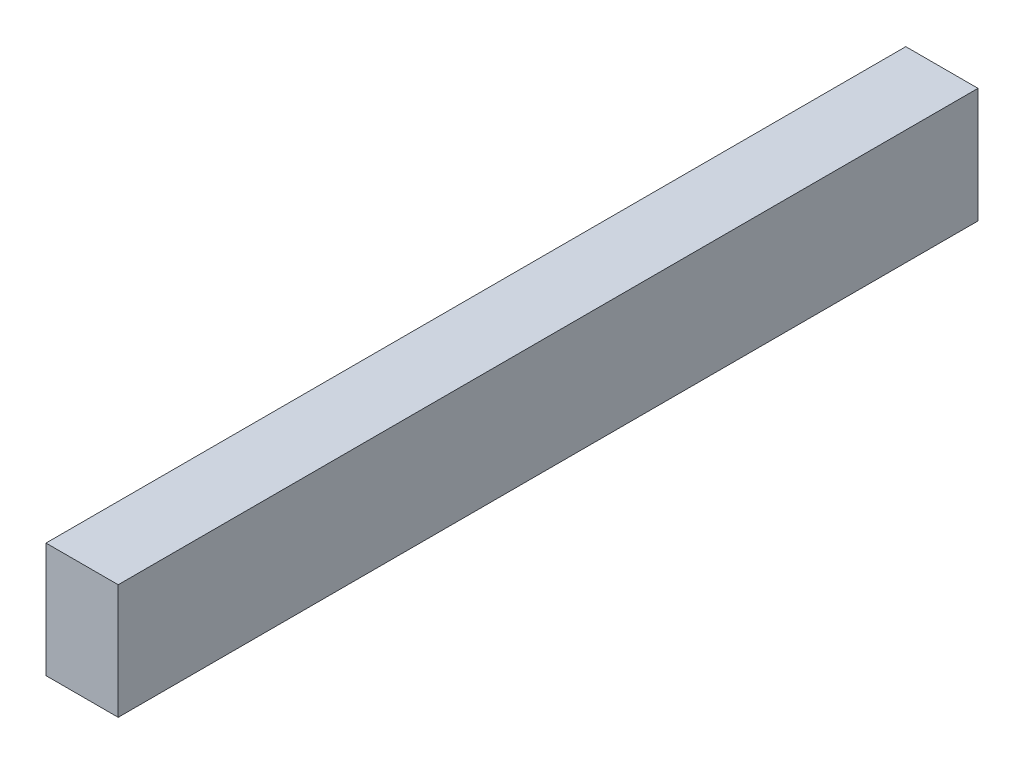
ISO-10303-21;
HEADER;
FILE_DESCRIPTION(('STEP AP214'),'2;1');
FILE_NAME('part.step','',(''),(''),'','','');
FILE_SCHEMA(('AUTOMOTIVE_DESIGN { 1 0 10303 214 1 1 1 1 }'));
ENDSEC;
DATA;
#1=APPLICATION_CONTEXT('core data for automotive mechanical design processes');
#2=APPLICATION_PROTOCOL_DEFINITION('international standard','automotive_design',2000,#1);
#3=PRODUCT_CONTEXT('',#1,'mechanical');
#4=PRODUCT('Part','Part','',(#3));
#5=PRODUCT_RELATED_PRODUCT_CATEGORY('part','',(#4));
#6=PRODUCT_DEFINITION_FORMATION('','',#4);
#7=PRODUCT_DEFINITION_CONTEXT('part definition',#1,'design');
#8=PRODUCT_DEFINITION('design','',#6,#7);
#9=PRODUCT_DEFINITION_SHAPE('','',#8);
#10=(LENGTH_UNIT() NAMED_UNIT(*) SI_UNIT(.MILLI.,.METRE.));
#11=(NAMED_UNIT(*) PLANE_ANGLE_UNIT() SI_UNIT($,.RADIAN.));
#12=(NAMED_UNIT(*) SI_UNIT($,.STERADIAN.) SOLID_ANGLE_UNIT());
#13=UNCERTAINTY_MEASURE_WITH_UNIT(LENGTH_MEASURE(1.E-05),#10,'distance_accuracy_value','');
#14=(GEOMETRIC_REPRESENTATION_CONTEXT(3) GLOBAL_UNCERTAINTY_ASSIGNED_CONTEXT((#13)) GLOBAL_UNIT_ASSIGNED_CONTEXT((#10,
#11,#12)) REPRESENTATION_CONTEXT('',''));
#15=CARTESIAN_POINT('',(0.,0.,0.));
#16=DIRECTION('',(0.,0.,1.));
#17=DIRECTION('',(1.,0.,0.));
#18=AXIS2_PLACEMENT_3D('',#15,#16,#17);
#19=CARTESIAN_POINT('',(-29.5625,10.50625,52.4));
#20=DIRECTION('',(1.,0.,0.));
#21=DIRECTION('',(0.,0.,-1.));
#22=AXIS2_PLACEMENT_3D('',#19,#20,#21);
#23=PLANE('',#22);
#24=DIRECTION('',(0.,-1.,0.));
#25=VECTOR('',#24,1.);
#26=CARTESIAN_POINT('',(-29.5625,10.50625,0.));
#27=LINE('',#26,#25);
#28=CARTESIAN_POINT('',(-29.5625,10.50625,0.));
#29=VERTEX_POINT('',#28);
#30=CARTESIAN_POINT('',(-29.5625,3.50624999999999,0.));
#31=VERTEX_POINT('',#30);
#32=EDGE_CURVE('E102',#29,#31,#27,.T.);
#33=ORIENTED_EDGE('',*,*,#32,.T.);
#34=DIRECTION('',(0.,0.,-1.));
#35=VECTOR('',#34,1.);
#36=CARTESIAN_POINT('',(-29.5625,3.50624999999999,52.4));
#37=LINE('',#36,#35);
#38=CARTESIAN_POINT('',(-29.5625,3.50624999999999,52.4));
#39=VERTEX_POINT('',#38);
#40=EDGE_CURVE('E11',#39,#31,#37,.T.);
#41=ORIENTED_EDGE('',*,*,#40,.F.);
#42=DIRECTION('',(0.,-1.,0.));
#43=VECTOR('',#42,1.);
#44=CARTESIAN_POINT('',(-29.5625,10.50625,52.4));
#45=LINE('',#44,#43);
#46=CARTESIAN_POINT('',(-29.5625,10.50625,52.4));
#47=VERTEX_POINT('',#46);
#48=EDGE_CURVE('E88',#47,#39,#45,.T.);
#49=ORIENTED_EDGE('',*,*,#48,.F.);
#50=DIRECTION('',(0.,0.,-1.));
#51=VECTOR('',#50,1.);
#52=CARTESIAN_POINT('',(-29.5625,10.50625,52.4));
#53=LINE('',#52,#51);
#54=EDGE_CURVE('E55',#47,#29,#53,.T.);
#55=ORIENTED_EDGE('',*,*,#54,.T.);
#56=EDGE_LOOP('',(#33,#41,#49,#55));
#57=FACE_BOUND('',#56,.T.);
#58=ADVANCED_FACE('F39',(#57),#23,.F.);
#59=CARTESIAN_POINT('',(-29.5625,3.50624999999999,52.4));
#60=DIRECTION('',(0.,1.,0.));
#61=DIRECTION('',(0.,0.,1.));
#62=AXIS2_PLACEMENT_3D('',#59,#60,#61);
#63=PLANE('',#62);
#64=DIRECTION('',(1.,0.,0.));
#65=VECTOR('',#64,1.);
#66=CARTESIAN_POINT('',(-29.5625,3.50624999999999,0.));
#67=LINE('',#66,#65);
#68=CARTESIAN_POINT('',(-25.1625,3.50624999999999,0.));
#69=VERTEX_POINT('',#68);
#70=EDGE_CURVE('E93',#31,#69,#67,.T.);
#71=ORIENTED_EDGE('',*,*,#70,.T.);
#72=DIRECTION('',(0.,0.,-1.));
#73=VECTOR('',#72,1.);
#74=CARTESIAN_POINT('',(-25.1625,3.50624999999999,52.4));
#75=LINE('',#74,#73);
#76=CARTESIAN_POINT('',(-25.1625,3.50624999999999,52.4));
#77=VERTEX_POINT('',#76);
#78=EDGE_CURVE('E47',#77,#69,#75,.T.);
#79=ORIENTED_EDGE('',*,*,#78,.F.);
#80=DIRECTION('',(1.,0.,0.));
#81=VECTOR('',#80,1.);
#82=CARTESIAN_POINT('',(-29.5625,3.50624999999999,52.4));
#83=LINE('',#82,#81);
#84=EDGE_CURVE('E80',#39,#77,#83,.T.);
#85=ORIENTED_EDGE('',*,*,#84,.F.);
#86=ORIENTED_EDGE('',*,*,#40,.T.);
#87=EDGE_LOOP('',(#71,#79,#85,#86));
#88=FACE_BOUND('',#87,.T.);
#89=ADVANCED_FACE('F92',(#88),#63,.F.);
#90=CARTESIAN_POINT('',(-25.1625,10.50625,52.4));
#91=DIRECTION('',(1.,0.,0.));
#92=DIRECTION('',(0.,0.,-1.));
#93=AXIS2_PLACEMENT_3D('',#90,#91,#92);
#94=PLANE('',#93);
#95=DIRECTION('',(0.,-1.,0.));
#96=VECTOR('',#95,1.);
#97=CARTESIAN_POINT('',(-25.1625,10.50625,0.));
#98=LINE('',#97,#96);
#99=CARTESIAN_POINT('',(-25.1625,10.50625,0.));
#100=VERTEX_POINT('',#99);
#101=EDGE_CURVE('E105',#100,#69,#98,.T.);
#102=ORIENTED_EDGE('',*,*,#101,.F.);
#103=DIRECTION('',(0.,0.,-1.));
#104=VECTOR('',#103,1.);
#105=CARTESIAN_POINT('',(-25.1625,10.50625,52.4));
#106=LINE('',#105,#104);
#107=CARTESIAN_POINT('',(-25.1625,10.50625,52.4));
#108=VERTEX_POINT('',#107);
#109=EDGE_CURVE('E69',#108,#100,#106,.T.);
#110=ORIENTED_EDGE('',*,*,#109,.F.);
#111=DIRECTION('',(0.,-1.,0.));
#112=VECTOR('',#111,1.);
#113=CARTESIAN_POINT('',(-25.1625,10.50625,52.4));
#114=LINE('',#113,#112);
#115=EDGE_CURVE('E87',#108,#77,#114,.T.);
#116=ORIENTED_EDGE('',*,*,#115,.T.);
#117=ORIENTED_EDGE('',*,*,#78,.T.);
#118=EDGE_LOOP('',(#102,#110,#116,#117));
#119=FACE_BOUND('',#118,.T.);
#120=ADVANCED_FACE('F96',(#119),#94,.T.);
#121=CARTESIAN_POINT('',(-29.5625,10.50625,52.4));
#122=DIRECTION('',(0.,1.,0.));
#123=DIRECTION('',(0.,0.,1.));
#124=AXIS2_PLACEMENT_3D('',#121,#122,#123);
#125=PLANE('',#124);
#126=DIRECTION('',(1.,0.,0.));
#127=VECTOR('',#126,1.);
#128=CARTESIAN_POINT('',(-29.5625,10.50625,0.));
#129=LINE('',#128,#127);
#130=EDGE_CURVE('E107',#29,#100,#129,.T.);
#131=ORIENTED_EDGE('',*,*,#130,.F.);
#132=ORIENTED_EDGE('',*,*,#54,.F.);
#133=DIRECTION('',(1.,0.,0.));
#134=VECTOR('',#133,1.);
#135=CARTESIAN_POINT('',(-29.5625,10.50625,52.4));
#136=LINE('',#135,#134);
#137=EDGE_CURVE('E97',#47,#108,#136,.T.);
#138=ORIENTED_EDGE('',*,*,#137,.T.);
#139=ORIENTED_EDGE('',*,*,#109,.T.);
#140=EDGE_LOOP('',(#131,#132,#138,#139));
#141=FACE_BOUND('',#140,.T.);
#142=ADVANCED_FACE('F113',(#141),#125,.T.);
#143=CARTESIAN_POINT('',(0.,0.,52.4));
#144=DIRECTION('',(0.,0.,1.));
#145=DIRECTION('',(1.,0.,0.));
#146=AXIS2_PLACEMENT_3D('',#143,#144,#145);
#147=PLANE('',#146);
#148=ORIENTED_EDGE('',*,*,#48,.T.);
#149=ORIENTED_EDGE('',*,*,#84,.T.);
#150=ORIENTED_EDGE('',*,*,#115,.F.);
#151=ORIENTED_EDGE('',*,*,#137,.F.);
#152=EDGE_LOOP('',(#148,#149,#150,#151));
#153=FACE_BOUND('',#152,.T.);
#154=ADVANCED_FACE('F84',(#153),#147,.T.);
#155=CARTESIAN_POINT('',(0.,0.,0.));
#156=DIRECTION('',(0.,0.,1.));
#157=DIRECTION('',(1.,0.,0.));
#158=AXIS2_PLACEMENT_3D('',#155,#156,#157);
#159=PLANE('',#158);
#160=ORIENTED_EDGE('',*,*,#32,.F.);
#161=ORIENTED_EDGE('',*,*,#130,.T.);
#162=ORIENTED_EDGE('',*,*,#101,.T.);
#163=ORIENTED_EDGE('',*,*,#70,.F.);
#164=EDGE_LOOP('',(#160,#161,#162,#163));
#165=FACE_BOUND('',#164,.T.);
#166=ADVANCED_FACE('F112',(#165),#159,.F.);
#167=CLOSED_SHELL('',(#58,#89,#120,#142,#154,#166));
#168=MANIFOLD_SOLID_BREP('B2',#167);
#169=ADVANCED_BREP_SHAPE_REPRESENTATION('',(#18,#168),#14);
#170=SHAPE_DEFINITION_REPRESENTATION(#9,#169);
ENDSEC;
END-ISO-10303-21;
